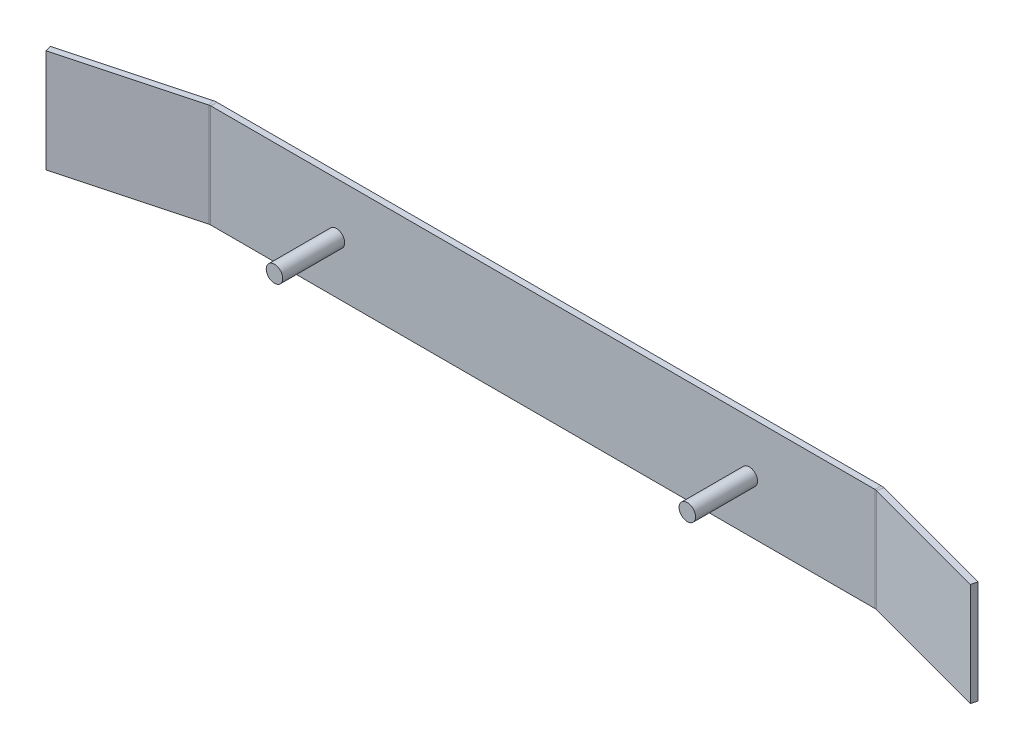
ISO-10303-21;
HEADER;
FILE_DESCRIPTION(('STEP AP214'),'2;1');
FILE_NAME('part.step','',(''),(''),'','','');
FILE_SCHEMA(('AUTOMOTIVE_DESIGN { 1 0 10303 214 1 1 1 1 }'));
ENDSEC;
DATA;
#1=APPLICATION_CONTEXT('core data for automotive mechanical design processes');
#2=APPLICATION_PROTOCOL_DEFINITION('international standard','automotive_design',2000,#1);
#3=PRODUCT_CONTEXT('',#1,'mechanical');
#4=PRODUCT('Part','Part','',(#3));
#5=PRODUCT_RELATED_PRODUCT_CATEGORY('part','',(#4));
#6=PRODUCT_DEFINITION_FORMATION('','',#4);
#7=PRODUCT_DEFINITION_CONTEXT('part definition',#1,'design');
#8=PRODUCT_DEFINITION('design','',#6,#7);
#9=PRODUCT_DEFINITION_SHAPE('','',#8);
#10=(LENGTH_UNIT() NAMED_UNIT(*) SI_UNIT(.MILLI.,.METRE.));
#11=(NAMED_UNIT(*) PLANE_ANGLE_UNIT() SI_UNIT($,.RADIAN.));
#12=(NAMED_UNIT(*) SI_UNIT($,.STERADIAN.) SOLID_ANGLE_UNIT());
#13=UNCERTAINTY_MEASURE_WITH_UNIT(LENGTH_MEASURE(1.E-05),#10,'distance_accuracy_value','');
#14=(GEOMETRIC_REPRESENTATION_CONTEXT(3) GLOBAL_UNCERTAINTY_ASSIGNED_CONTEXT((#13)) GLOBAL_UNIT_ASSIGNED_CONTEXT((#10,
#11,#12)) REPRESENTATION_CONTEXT('',''));
#15=CARTESIAN_POINT('',(0.,0.,0.));
#16=DIRECTION('',(0.,0.,1.));
#17=DIRECTION('',(1.,0.,0.));
#18=AXIS2_PLACEMENT_3D('',#15,#16,#17);
#19=CARTESIAN_POINT('',(-226.5,-25.,-3.));
#20=DIRECTION('',(0.,-1.,0.));
#21=DIRECTION('',(1.,0.,0.));
#22=AXIS2_PLACEMENT_3D('',#19,#20,#21);
#23=PLANE('',#22);
#24=DIRECTION('',(1.,0.,0.));
#25=VECTOR('',#24,1.);
#26=CARTESIAN_POINT('',(-226.5,-25.,-3.));
#27=LINE('',#26,#25);
#28=CARTESIAN_POINT('',(-160.910951377452,-25.,-3.));
#29=VERTEX_POINT('',#28);
#30=CARTESIAN_POINT('',(160.910951377452,-25.,-3.));
#31=VERTEX_POINT('',#30);
#32=EDGE_CURVE('E227',#29,#31,#27,.T.);
#33=ORIENTED_EDGE('',*,*,#32,.T.);
#34=DIRECTION('',(0.,0.,1.));
#35=VECTOR('',#34,1.);
#36=CARTESIAN_POINT('',(160.910951377452,-25.,-3.));
#37=LINE('',#36,#35);
#38=CARTESIAN_POINT('',(160.910951377452,-25.,0.));
#39=VERTEX_POINT('',#38);
#40=EDGE_CURVE('E243',#31,#39,#37,.T.);
#41=ORIENTED_EDGE('',*,*,#40,.T.);
#42=DIRECTION('',(1.,0.,0.));
#43=VECTOR('',#42,1.);
#44=CARTESIAN_POINT('',(-226.5,-25.,0.));
#45=LINE('',#44,#43);
#46=CARTESIAN_POINT('',(-160.910951377452,-25.,0.));
#47=VERTEX_POINT('',#46);
#48=EDGE_CURVE('E249',#47,#39,#45,.T.);
#49=ORIENTED_EDGE('',*,*,#48,.F.);
#50=DIRECTION('',(0.,0.,1.));
#51=VECTOR('',#50,1.);
#52=CARTESIAN_POINT('',(-160.910951377452,-25.,-3.));
#53=LINE('',#52,#51);
#54=EDGE_CURVE('E226',#29,#47,#53,.T.);
#55=ORIENTED_EDGE('',*,*,#54,.F.);
#56=EDGE_LOOP('',(#33,#41,#49,#55));
#57=FACE_BOUND('',#56,.T.);
#58=ADVANCED_FACE('F47',(#57),#23,.T.);
#59=CARTESIAN_POINT('',(-226.5,25.,-3.));
#60=DIRECTION('',(0.,1.,0.));
#61=DIRECTION('',(-1.,0.,0.));
#62=AXIS2_PLACEMENT_3D('',#59,#60,#61);
#63=PLANE('',#62);
#64=DIRECTION('',(-1.,0.,0.));
#65=VECTOR('',#64,1.);
#66=CARTESIAN_POINT('',(-226.5,25.,0.));
#67=LINE('',#66,#65);
#68=CARTESIAN_POINT('',(160.910951377452,25.,0.));
#69=VERTEX_POINT('',#68);
#70=CARTESIAN_POINT('',(-160.910951377452,25.,0.));
#71=VERTEX_POINT('',#70);
#72=EDGE_CURVE('E69',#69,#71,#67,.T.);
#73=ORIENTED_EDGE('',*,*,#72,.F.);
#74=DIRECTION('',(0.,0.,-1.));
#75=VECTOR('',#74,1.);
#76=CARTESIAN_POINT('',(160.910951377452,25.,-3.));
#77=LINE('',#76,#75);
#78=CARTESIAN_POINT('',(160.910951377452,25.,-3.));
#79=VERTEX_POINT('',#78);
#80=EDGE_CURVE('E238',#69,#79,#77,.T.);
#81=ORIENTED_EDGE('',*,*,#80,.T.);
#82=DIRECTION('',(-1.,0.,0.));
#83=VECTOR('',#82,1.);
#84=CARTESIAN_POINT('',(-226.5,25.,-3.));
#85=LINE('',#84,#83);
#86=CARTESIAN_POINT('',(-160.910951377452,25.,-3.));
#87=VERTEX_POINT('',#86);
#88=EDGE_CURVE('E248',#79,#87,#85,.T.);
#89=ORIENTED_EDGE('',*,*,#88,.T.);
#90=DIRECTION('',(0.,0.,-1.));
#91=VECTOR('',#90,1.);
#92=CARTESIAN_POINT('',(-160.910951377452,25.,-3.));
#93=LINE('',#92,#91);
#94=EDGE_CURVE('E232',#71,#87,#93,.T.);
#95=ORIENTED_EDGE('',*,*,#94,.F.);
#96=EDGE_LOOP('',(#73,#81,#89,#95));
#97=FACE_BOUND('',#96,.T.);
#98=ADVANCED_FACE('F272',(#97),#63,.T.);
#99=CARTESIAN_POINT('',(0.,0.,-3.));
#100=DIRECTION('',(0.,0.,-1.));
#101=DIRECTION('',(-1.,0.,0.));
#102=AXIS2_PLACEMENT_3D('',#99,#100,#101);
#103=PLANE('',#102);
#104=ORIENTED_EDGE('',*,*,#88,.F.);
#105=DIRECTION('',(0.,-1.,0.));
#106=VECTOR('',#105,1.);
#107=CARTESIAN_POINT('',(160.910951377452,0.,-3.));
#108=LINE('',#107,#106);
#109=EDGE_CURVE('E235',#79,#31,#108,.T.);
#110=ORIENTED_EDGE('',*,*,#109,.T.);
#111=ORIENTED_EDGE('',*,*,#32,.F.);
#112=DIRECTION('',(0.,-1.,0.));
#113=VECTOR('',#112,1.);
#114=CARTESIAN_POINT('',(-160.910951377452,0.,-3.));
#115=LINE('',#114,#113);
#116=EDGE_CURVE('E223',#87,#29,#115,.T.);
#117=ORIENTED_EDGE('',*,*,#116,.F.);
#118=EDGE_LOOP('',(#104,#110,#111,#117));
#119=FACE_BOUND('',#118,.T.);
#120=ADVANCED_FACE('F262',(#119),#103,.T.);
#121=CARTESIAN_POINT('',(0.,0.,0.));
#122=DIRECTION('',(0.,0.,-1.));
#123=DIRECTION('',(-1.,0.,0.));
#124=AXIS2_PLACEMENT_3D('',#121,#122,#123);
#125=PLANE('',#124);
#126=CARTESIAN_POINT('',(100.,0.,0.));
#127=DIRECTION('',(0.,0.,-1.));
#128=DIRECTION('',(-1.,0.,0.));
#129=AXIS2_PLACEMENT_3D('',#126,#127,#128);
#130=CIRCLE('',#129,4.00000000000001);
#131=CARTESIAN_POINT('',(96.,0.,0.));
#132=VERTEX_POINT('',#131);
#133=EDGE_CURVE('E12',#132,#132,#130,.F.);
#134=ORIENTED_EDGE('',*,*,#133,.F.);
#135=EDGE_LOOP('',(#134));
#136=FACE_BOUND('',#135,.T.);
#137=CARTESIAN_POINT('',(-100.,0.,0.));
#138=DIRECTION('',(0.,0.,-1.));
#139=DIRECTION('',(-1.,0.,0.));
#140=AXIS2_PLACEMENT_3D('',#137,#138,#139);
#141=CIRCLE('',#140,4.00000000000001);
#142=CARTESIAN_POINT('',(-104.,0.,0.));
#143=VERTEX_POINT('',#142);
#144=EDGE_CURVE('E54',#143,#143,#141,.F.);
#145=ORIENTED_EDGE('',*,*,#144,.F.);
#146=EDGE_LOOP('',(#145));
#147=FACE_BOUND('',#146,.T.);
#148=DIRECTION('',(0.,-1.,0.));
#149=VECTOR('',#148,1.);
#150=CARTESIAN_POINT('',(160.910951377452,0.,0.));
#151=LINE('',#150,#149);
#152=EDGE_CURVE('E241',#69,#39,#151,.T.);
#153=ORIENTED_EDGE('',*,*,#152,.F.);
#154=ORIENTED_EDGE('',*,*,#72,.T.);
#155=DIRECTION('',(0.,-1.,0.));
#156=VECTOR('',#155,1.);
#157=CARTESIAN_POINT('',(-160.910951377452,0.,0.));
#158=LINE('',#157,#156);
#159=EDGE_CURVE('E230',#71,#47,#158,.T.);
#160=ORIENTED_EDGE('',*,*,#159,.T.);
#161=ORIENTED_EDGE('',*,*,#48,.T.);
#162=EDGE_LOOP('',(#153,#154,#160,#161));
#163=FACE_BOUND('',#162,.T.);
#164=ADVANCED_FACE('F259',(#136,#147,#163),#125,.F.);
#165=CARTESIAN_POINT('',(-160.910951377452,25.,3.));
#166=DIRECTION('',(0.,1.,0.));
#167=DIRECTION('',(0.,0.,1.));
#168=AXIS2_PLACEMENT_3D('',#165,#166,#167);
#169=PLANE('',#168);
#170=DIRECTION('',(-0.258819045102521,0.,-0.965925826289068));
#171=VECTOR('',#170,1.);
#172=CARTESIAN_POINT('',(-162.463865648067,25.,-2.79555495773442));
#173=LINE('',#172,#171);
#174=CARTESIAN_POINT('',(-161.68740851276,25.,0.102222521132796));
#175=VERTEX_POINT('',#174);
#176=CARTESIAN_POINT('',(-162.463865648067,25.,-2.79555495773441));
#177=VERTEX_POINT('',#176);
#178=EDGE_CURVE('E188',#175,#177,#173,.T.);
#179=ORIENTED_EDGE('',*,*,#178,.F.);
#180=CARTESIAN_POINT('',(-160.910951377452,25.,3.));
#181=DIRECTION('',(0.,1.,0.));
#182=DIRECTION('',(0.,0.,1.));
#183=AXIS2_PLACEMENT_3D('',#180,#181,#182);
#184=CIRCLE('',#183,3.);
#185=EDGE_CURVE('E185',#175,#71,#184,.F.);
#186=ORIENTED_EDGE('',*,*,#185,.T.);
#187=ORIENTED_EDGE('',*,*,#94,.T.);
#188=CARTESIAN_POINT('',(-160.910951377452,25.,3.));
#189=DIRECTION('',(0.,-1.,0.));
#190=DIRECTION('',(0.,0.,1.));
#191=AXIS2_PLACEMENT_3D('',#188,#189,#190);
#192=CIRCLE('',#191,6.);
#193=EDGE_CURVE('E212',#177,#87,#192,.T.);
#194=ORIENTED_EDGE('',*,*,#193,.F.);
#195=EDGE_LOOP('',(#179,#186,#187,#194));
#196=FACE_BOUND('',#195,.T.);
#197=ADVANCED_FACE('F261',(#196),#169,.T.);
#198=CARTESIAN_POINT('',(-160.910951377452,-25.,3.));
#199=DIRECTION('',(0.,-1.,0.));
#200=DIRECTION('',(0.,0.,-1.));
#201=AXIS2_PLACEMENT_3D('',#198,#199,#200);
#202=PLANE('',#201);
#203=CARTESIAN_POINT('',(-160.910951377452,-25.,3.));
#204=DIRECTION('',(0.,1.,0.));
#205=DIRECTION('',(0.,0.,1.));
#206=AXIS2_PLACEMENT_3D('',#203,#204,#205);
#207=CIRCLE('',#206,3.);
#208=CARTESIAN_POINT('',(-161.687408512759,-25.,0.102222521132789));
#209=VERTEX_POINT('',#208);
#210=EDGE_CURVE('E216',#47,#209,#207,.T.);
#211=ORIENTED_EDGE('',*,*,#210,.T.);
#212=DIRECTION('',(0.258819045102521,0.,0.965925826289068));
#213=VECTOR('',#212,1.);
#214=CARTESIAN_POINT('',(-162.463865648067,-25.,-2.79555495773442));
#215=LINE('',#214,#213);
#216=CARTESIAN_POINT('',(-162.463865648067,-25.,-2.79555495773442));
#217=VERTEX_POINT('',#216);
#218=EDGE_CURVE('E197',#217,#209,#215,.T.);
#219=ORIENTED_EDGE('',*,*,#218,.F.);
#220=CARTESIAN_POINT('',(-160.910951377452,-25.,3.));
#221=DIRECTION('',(0.,1.,0.));
#222=DIRECTION('',(0.,0.,-1.));
#223=AXIS2_PLACEMENT_3D('',#220,#221,#222);
#224=CIRCLE('',#223,6.);
#225=EDGE_CURVE('E215',#29,#217,#224,.T.);
#226=ORIENTED_EDGE('',*,*,#225,.F.);
#227=ORIENTED_EDGE('',*,*,#54,.T.);
#228=EDGE_LOOP('',(#211,#219,#226,#227));
#229=FACE_BOUND('',#228,.T.);
#230=ADVANCED_FACE('F297',(#229),#202,.T.);
#231=CARTESIAN_POINT('',(-160.910951377452,-50.1037714460589,3.));
#232=DIRECTION('',(0.,1.,0.));
#233=DIRECTION('',(0.,0.,1.));
#234=AXIS2_PLACEMENT_3D('',#231,#232,#233);
#235=CYLINDRICAL_SURFACE('',#234,6.);
#236=ORIENTED_EDGE('',*,*,#116,.T.);
#237=ORIENTED_EDGE('',*,*,#225,.T.);
#238=DIRECTION('',(0.,-1.,0.));
#239=VECTOR('',#238,1.);
#240=CARTESIAN_POINT('',(-162.463865648067,0.,-2.79555495773442));
#241=LINE('',#240,#239);
#242=EDGE_CURVE('E203',#177,#217,#241,.T.);
#243=ORIENTED_EDGE('',*,*,#242,.F.);
#244=ORIENTED_EDGE('',*,*,#193,.T.);
#245=EDGE_LOOP('',(#236,#237,#243,#244));
#246=FACE_BOUND('',#245,.T.);
#247=ADVANCED_FACE('F293',(#246),#235,.T.);
#248=CARTESIAN_POINT('',(-160.910951377452,-50.1037714460589,3.));
#249=DIRECTION('',(0.,1.,0.));
#250=DIRECTION('',(0.,0.,1.));
#251=AXIS2_PLACEMENT_3D('',#248,#249,#250);
#252=CYLINDRICAL_SURFACE('',#251,3.);
#253=ORIENTED_EDGE('',*,*,#159,.F.);
#254=ORIENTED_EDGE('',*,*,#185,.F.);
#255=DIRECTION('',(0.,-1.,0.));
#256=VECTOR('',#255,1.);
#257=CARTESIAN_POINT('',(-161.687408512759,0.,0.102222521132789));
#258=LINE('',#257,#256);
#259=EDGE_CURVE('E178',#175,#209,#258,.T.);
#260=ORIENTED_EDGE('',*,*,#259,.T.);
#261=ORIENTED_EDGE('',*,*,#210,.F.);
#262=EDGE_LOOP('',(#253,#254,#260,#261));
#263=FACE_BOUND('',#262,.T.);
#264=ADVANCED_FACE('F280',(#263),#252,.F.);
#265=CARTESIAN_POINT('',(-224.680067079397,-25.,13.8752259719226));
#266=DIRECTION('',(-0.965925826289068,0.,0.258819045102521));
#267=DIRECTION('',(0.258819045102521,0.,0.965925826289068));
#268=AXIS2_PLACEMENT_3D('',#265,#266,#267);
#269=PLANE('',#268);
#270=DIRECTION('',(0.,-1.,0.));
#271=VECTOR('',#270,1.);
#272=CARTESIAN_POINT('',(-223.90360994409,-25.,16.7730034507898));
#273=LINE('',#272,#271);
#274=CARTESIAN_POINT('',(-223.90360994409,25.,16.7730034507898));
#275=VERTEX_POINT('',#274);
#276=CARTESIAN_POINT('',(-223.90360994409,-25.,16.7730034507898));
#277=VERTEX_POINT('',#276);
#278=EDGE_CURVE('E192',#275,#277,#273,.T.);
#279=ORIENTED_EDGE('',*,*,#278,.F.);
#280=DIRECTION('',(0.258819045102521,0.,0.965925826289068));
#281=VECTOR('',#280,1.);
#282=CARTESIAN_POINT('',(-224.680067079397,25.,13.8752259719226));
#283=LINE('',#282,#281);
#284=CARTESIAN_POINT('',(-224.680067079397,25.,13.8752259719226));
#285=VERTEX_POINT('',#284);
#286=EDGE_CURVE('E182',#285,#275,#283,.T.);
#287=ORIENTED_EDGE('',*,*,#286,.F.);
#288=DIRECTION('',(0.,-1.,0.));
#289=VECTOR('',#288,1.);
#290=CARTESIAN_POINT('',(-224.680067079397,-25.,13.8752259719226));
#291=LINE('',#290,#289);
#292=CARTESIAN_POINT('',(-224.680067079397,-25.,13.8752259719226));
#293=VERTEX_POINT('',#292);
#294=EDGE_CURVE('E207',#285,#293,#291,.T.);
#295=ORIENTED_EDGE('',*,*,#294,.T.);
#296=DIRECTION('',(0.258819045102521,0.,0.965925826289068));
#297=VECTOR('',#296,1.);
#298=CARTESIAN_POINT('',(-224.680067079397,-25.,13.8752259719226));
#299=LINE('',#298,#297);
#300=EDGE_CURVE('E205',#293,#277,#299,.T.);
#301=ORIENTED_EDGE('',*,*,#300,.T.);
#302=EDGE_LOOP('',(#279,#287,#295,#301));
#303=FACE_BOUND('',#302,.T.);
#304=ADVANCED_FACE('F306',(#303),#269,.T.);
#305=CARTESIAN_POINT('',(-5.89786742492336,0.,-44.7472877437985));
#306=DIRECTION('',(-0.258819045102521,0.,-0.965925826289068));
#307=DIRECTION('',(-0.965925826289068,0.,0.258819045102521));
#308=AXIS2_PLACEMENT_3D('',#305,#306,#307);
#309=PLANE('',#308);
#310=DIRECTION('',(-0.965925826289068,0.,0.258819045102521));
#311=VECTOR('',#310,1.);
#312=CARTESIAN_POINT('',(-224.680067079397,25.,13.8752259719226));
#313=LINE('',#312,#311);
#314=EDGE_CURVE('E186',#177,#285,#313,.T.);
#315=ORIENTED_EDGE('',*,*,#314,.F.);
#316=ORIENTED_EDGE('',*,*,#242,.T.);
#317=DIRECTION('',(0.965925826289068,0.,-0.258819045102521));
#318=VECTOR('',#317,1.);
#319=CARTESIAN_POINT('',(-224.680067079397,-25.,13.8752259719226));
#320=LINE('',#319,#318);
#321=EDGE_CURVE('E200',#293,#217,#320,.T.);
#322=ORIENTED_EDGE('',*,*,#321,.F.);
#323=ORIENTED_EDGE('',*,*,#294,.F.);
#324=EDGE_LOOP('',(#315,#316,#322,#323));
#325=FACE_BOUND('',#324,.T.);
#326=ADVANCED_FACE('F290',(#325),#309,.T.);
#327=CARTESIAN_POINT('',(-224.680067079397,-25.,13.8752259719226));
#328=DIRECTION('',(0.,-1.,0.));
#329=DIRECTION('',(0.965925826289068,0.,-0.258819045102521));
#330=AXIS2_PLACEMENT_3D('',#327,#328,#329);
#331=PLANE('',#330);
#332=ORIENTED_EDGE('',*,*,#321,.T.);
#333=ORIENTED_EDGE('',*,*,#218,.T.);
#334=DIRECTION('',(0.965925826289068,0.,-0.258819045102521));
#335=VECTOR('',#334,1.);
#336=CARTESIAN_POINT('',(-223.90360994409,-25.,16.7730034507898));
#337=LINE('',#336,#335);
#338=EDGE_CURVE('E190',#277,#209,#337,.T.);
#339=ORIENTED_EDGE('',*,*,#338,.F.);
#340=ORIENTED_EDGE('',*,*,#300,.F.);
#341=EDGE_LOOP('',(#332,#333,#339,#340));
#342=FACE_BOUND('',#341,.T.);
#343=ADVANCED_FACE('F301',(#342),#331,.T.);
#344=CARTESIAN_POINT('',(-5.1214102896158,0.,-41.8495102649313));
#345=DIRECTION('',(-0.258819045102521,0.,-0.965925826289068));
#346=DIRECTION('',(-0.965925826289068,0.,0.258819045102521));
#347=AXIS2_PLACEMENT_3D('',#344,#345,#346);
#348=PLANE('',#347);
#349=ORIENTED_EDGE('',*,*,#259,.F.);
#350=DIRECTION('',(-0.965925826289068,0.,0.258819045102521));
#351=VECTOR('',#350,1.);
#352=CARTESIAN_POINT('',(-223.90360994409,25.,16.7730034507898));
#353=LINE('',#352,#351);
#354=EDGE_CURVE('E195',#175,#275,#353,.T.);
#355=ORIENTED_EDGE('',*,*,#354,.T.);
#356=ORIENTED_EDGE('',*,*,#278,.T.);
#357=ORIENTED_EDGE('',*,*,#338,.T.);
#358=EDGE_LOOP('',(#349,#355,#356,#357));
#359=FACE_BOUND('',#358,.T.);
#360=ADVANCED_FACE('F303',(#359),#348,.F.);
#361=CARTESIAN_POINT('',(-224.680067079397,25.,13.8752259719226));
#362=DIRECTION('',(0.,1.,0.));
#363=DIRECTION('',(-0.965925826289068,0.,0.258819045102521));
#364=AXIS2_PLACEMENT_3D('',#361,#362,#363);
#365=PLANE('',#364);
#366=ORIENTED_EDGE('',*,*,#354,.F.);
#367=ORIENTED_EDGE('',*,*,#178,.T.);
#368=ORIENTED_EDGE('',*,*,#314,.T.);
#369=ORIENTED_EDGE('',*,*,#286,.T.);
#370=EDGE_LOOP('',(#366,#367,#368,#369));
#371=FACE_BOUND('',#370,.T.);
#372=ADVANCED_FACE('F284',(#371),#365,.T.);
#373=CARTESIAN_POINT('',(160.910951377452,25.,3.));
#374=DIRECTION('',(0.,1.,0.));
#375=DIRECTION('',(0.,0.,1.));
#376=AXIS2_PLACEMENT_3D('',#373,#374,#375);
#377=PLANE('',#376);
#378=ORIENTED_EDGE('',*,*,#80,.F.);
#379=CARTESIAN_POINT('',(160.910951377452,25.,3.));
#380=DIRECTION('',(0.,-1.,0.));
#381=DIRECTION('',(1.,0.,0.));
#382=AXIS2_PLACEMENT_3D('',#379,#380,#381);
#383=CIRCLE('',#382,3.);
#384=CARTESIAN_POINT('',(161.687408512759,25.,0.10222252113274));
#385=VERTEX_POINT('',#384);
#386=EDGE_CURVE('E154',#69,#385,#383,.T.);
#387=ORIENTED_EDGE('',*,*,#386,.T.);
#388=DIRECTION('',(0.258819045102521,0.,-0.965925826289068));
#389=VECTOR('',#388,1.);
#390=CARTESIAN_POINT('',(162.463865648067,25.,-2.79555495773444));
#391=LINE('',#390,#389);
#392=CARTESIAN_POINT('',(162.463865648067,25.,-2.79555495773445));
#393=VERTEX_POINT('',#392);
#394=EDGE_CURVE('E161',#385,#393,#391,.T.);
#395=ORIENTED_EDGE('',*,*,#394,.T.);
#396=CARTESIAN_POINT('',(160.910951377452,25.,3.));
#397=DIRECTION('',(0.,-1.,0.));
#398=DIRECTION('',(0.,0.,1.));
#399=AXIS2_PLACEMENT_3D('',#396,#397,#398);
#400=CIRCLE('',#399,6.);
#401=EDGE_CURVE('E172',#79,#393,#400,.T.);
#402=ORIENTED_EDGE('',*,*,#401,.F.);
#403=EDGE_LOOP('',(#378,#387,#395,#402));
#404=FACE_BOUND('',#403,.T.);
#405=ADVANCED_FACE('F327',(#404),#377,.T.);
#406=CARTESIAN_POINT('',(160.910951377452,-25.,3.));
#407=DIRECTION('',(0.,-1.,0.));
#408=DIRECTION('',(0.,0.,-1.));
#409=AXIS2_PLACEMENT_3D('',#406,#407,#408);
#410=PLANE('',#409);
#411=CARTESIAN_POINT('',(160.910951377452,-25.,3.));
#412=DIRECTION('',(0.,-1.,0.));
#413=DIRECTION('',(1.,0.,0.));
#414=AXIS2_PLACEMENT_3D('',#411,#412,#413);
#415=CIRCLE('',#414,3.);
#416=CARTESIAN_POINT('',(161.68740851276,-25.,0.102222521132782));
#417=VERTEX_POINT('',#416);
#418=EDGE_CURVE('E61',#417,#39,#415,.F.);
#419=ORIENTED_EDGE('',*,*,#418,.T.);
#420=ORIENTED_EDGE('',*,*,#40,.F.);
#421=CARTESIAN_POINT('',(160.910951377452,-25.,3.));
#422=DIRECTION('',(0.,1.,0.));
#423=DIRECTION('',(0.,0.,-1.));
#424=AXIS2_PLACEMENT_3D('',#421,#422,#423);
#425=CIRCLE('',#424,6.);
#426=CARTESIAN_POINT('',(162.463865648067,-25.,-2.79555495773439));
#427=VERTEX_POINT('',#426);
#428=EDGE_CURVE('E175',#427,#31,#425,.T.);
#429=ORIENTED_EDGE('',*,*,#428,.F.);
#430=DIRECTION('',(-0.258819045102521,0.,0.965925826289068));
#431=VECTOR('',#430,1.);
#432=CARTESIAN_POINT('',(162.463865648067,-25.,-2.79555495773443));
#433=LINE('',#432,#431);
#434=EDGE_CURVE('E143',#427,#417,#433,.T.);
#435=ORIENTED_EDGE('',*,*,#434,.T.);
#436=EDGE_LOOP('',(#419,#420,#429,#435));
#437=FACE_BOUND('',#436,.T.);
#438=ADVANCED_FACE('F378',(#437),#410,.T.);
#439=CARTESIAN_POINT('',(160.910951377452,50.1037714460589,3.));
#440=DIRECTION('',(0.,-1.,0.));
#441=DIRECTION('',(1.,0.,0.));
#442=AXIS2_PLACEMENT_3D('',#439,#440,#441);
#443=CYLINDRICAL_SURFACE('',#442,6.);
#444=DIRECTION('',(0.,-1.,0.));
#445=VECTOR('',#444,1.);
#446=CARTESIAN_POINT('',(162.463865648067,0.,-2.79555495773443));
#447=LINE('',#446,#445);
#448=EDGE_CURVE('E169',#393,#427,#447,.T.);
#449=ORIENTED_EDGE('',*,*,#448,.T.);
#450=ORIENTED_EDGE('',*,*,#428,.T.);
#451=ORIENTED_EDGE('',*,*,#109,.F.);
#452=ORIENTED_EDGE('',*,*,#401,.T.);
#453=EDGE_LOOP('',(#449,#450,#451,#452));
#454=FACE_BOUND('',#453,.T.);
#455=ADVANCED_FACE('F325',(#454),#443,.T.);
#456=CARTESIAN_POINT('',(160.910951377452,50.1037714460589,3.));
#457=DIRECTION('',(0.,-1.,0.));
#458=DIRECTION('',(1.,0.,0.));
#459=AXIS2_PLACEMENT_3D('',#456,#457,#458);
#460=CYLINDRICAL_SURFACE('',#459,3.);
#461=DIRECTION('',(0.,-1.,0.));
#462=VECTOR('',#461,1.);
#463=CARTESIAN_POINT('',(161.68740851276,0.,0.102222521132775));
#464=LINE('',#463,#462);
#465=EDGE_CURVE('E269',#385,#417,#464,.T.);
#466=ORIENTED_EDGE('',*,*,#465,.F.);
#467=ORIENTED_EDGE('',*,*,#386,.F.);
#468=ORIENTED_EDGE('',*,*,#152,.T.);
#469=ORIENTED_EDGE('',*,*,#418,.F.);
#470=EDGE_LOOP('',(#466,#467,#468,#469));
#471=FACE_BOUND('',#470,.T.);
#472=ADVANCED_FACE('F267',(#471),#460,.F.);
#473=CARTESIAN_POINT('',(224.680067079397,-25.,13.8752259719226));
#474=DIRECTION('',(0.965925826289068,0.,0.258819045102521));
#475=DIRECTION('',(0.,1.,0.));
#476=AXIS2_PLACEMENT_3D('',#473,#474,#475);
#477=PLANE('',#476);
#478=DIRECTION('',(0.,1.,0.));
#479=VECTOR('',#478,1.);
#480=CARTESIAN_POINT('',(223.90360994409,-25.,16.7730034507898));
#481=LINE('',#480,#479);
#482=CARTESIAN_POINT('',(223.90360994409,-25.,16.7730034507898));
#483=VERTEX_POINT('',#482);
#484=CARTESIAN_POINT('',(223.90360994409,25.,16.7730034507898));
#485=VERTEX_POINT('',#484);
#486=EDGE_CURVE('E147',#483,#485,#481,.T.);
#487=ORIENTED_EDGE('',*,*,#486,.F.);
#488=DIRECTION('',(-0.258819045102521,0.,0.965925826289068));
#489=VECTOR('',#488,1.);
#490=CARTESIAN_POINT('',(224.680067079397,-25.,13.8752259719226));
#491=LINE('',#490,#489);
#492=CARTESIAN_POINT('',(224.680067079397,-25.,13.8752259719226));
#493=VERTEX_POINT('',#492);
#494=EDGE_CURVE('E141',#493,#483,#491,.T.);
#495=ORIENTED_EDGE('',*,*,#494,.F.);
#496=DIRECTION('',(0.,1.,0.));
#497=VECTOR('',#496,1.);
#498=CARTESIAN_POINT('',(224.680067079397,-25.,13.8752259719226));
#499=LINE('',#498,#497);
#500=CARTESIAN_POINT('',(224.680067079397,25.,13.8752259719226));
#501=VERTEX_POINT('',#500);
#502=EDGE_CURVE('E152',#493,#501,#499,.T.);
#503=ORIENTED_EDGE('',*,*,#502,.T.);
#504=DIRECTION('',(-0.258819045102521,0.,0.965925826289068));
#505=VECTOR('',#504,1.);
#506=CARTESIAN_POINT('',(224.680067079397,25.,13.8752259719226));
#507=LINE('',#506,#505);
#508=EDGE_CURVE('E160',#501,#485,#507,.T.);
#509=ORIENTED_EDGE('',*,*,#508,.T.);
#510=EDGE_LOOP('',(#487,#495,#503,#509));
#511=FACE_BOUND('',#510,.T.);
#512=ADVANCED_FACE('F151',(#511),#477,.T.);
#513=CARTESIAN_POINT('',(5.89786742492336,0.,-44.7472877437985));
#514=DIRECTION('',(0.258819045102521,0.,-0.965925826289068));
#515=DIRECTION('',(-0.965925826289068,0.,-0.258819045102521));
#516=AXIS2_PLACEMENT_3D('',#513,#514,#515);
#517=PLANE('',#516);
#518=ORIENTED_EDGE('',*,*,#448,.F.);
#519=DIRECTION('',(-0.965925826289068,0.,-0.258819045102521));
#520=VECTOR('',#519,1.);
#521=CARTESIAN_POINT('',(-212.884332229551,25.,-103.36980145952));
#522=LINE('',#521,#520);
#523=EDGE_CURVE('E159',#501,#393,#522,.T.);
#524=ORIENTED_EDGE('',*,*,#523,.F.);
#525=ORIENTED_EDGE('',*,*,#502,.F.);
#526=DIRECTION('',(0.965925826289068,0.,0.258819045102521));
#527=VECTOR('',#526,1.);
#528=CARTESIAN_POINT('',(-212.884332229551,-25.,-103.36980145952));
#529=LINE('',#528,#527);
#530=EDGE_CURVE('E138',#427,#493,#529,.T.);
#531=ORIENTED_EDGE('',*,*,#530,.F.);
#532=EDGE_LOOP('',(#518,#524,#525,#531));
#533=FACE_BOUND('',#532,.T.);
#534=ADVANCED_FACE('F157',(#533),#517,.T.);
#535=CARTESIAN_POINT('',(-212.884332229551,25.,-103.36980145952));
#536=DIRECTION('',(0.,1.,0.));
#537=DIRECTION('',(-0.965925826289068,0.,-0.258819045102521));
#538=AXIS2_PLACEMENT_3D('',#535,#536,#537);
#539=PLANE('',#538);
#540=ORIENTED_EDGE('',*,*,#394,.F.);
#541=DIRECTION('',(-0.965925826289068,0.,-0.258819045102521));
#542=VECTOR('',#541,1.);
#543=CARTESIAN_POINT('',(-213.660789364858,25.,-100.472023980652));
#544=LINE('',#543,#542);
#545=EDGE_CURVE('E332',#485,#385,#544,.T.);
#546=ORIENTED_EDGE('',*,*,#545,.F.);
#547=ORIENTED_EDGE('',*,*,#508,.F.);
#548=ORIENTED_EDGE('',*,*,#523,.T.);
#549=EDGE_LOOP('',(#540,#546,#547,#548));
#550=FACE_BOUND('',#549,.T.);
#551=ADVANCED_FACE('F331',(#550),#539,.T.);
#552=CARTESIAN_POINT('',(5.1214102896158,0.,-41.8495102649313));
#553=DIRECTION('',(0.258819045102521,0.,-0.965925826289068));
#554=DIRECTION('',(-0.965925826289068,0.,-0.258819045102521));
#555=AXIS2_PLACEMENT_3D('',#552,#553,#554);
#556=PLANE('',#555);
#557=ORIENTED_EDGE('',*,*,#545,.T.);
#558=ORIENTED_EDGE('',*,*,#465,.T.);
#559=DIRECTION('',(0.965925826289068,0.,0.258819045102521));
#560=VECTOR('',#559,1.);
#561=CARTESIAN_POINT('',(-213.660789364858,-25.,-100.472023980652));
#562=LINE('',#561,#560);
#563=EDGE_CURVE('E336',#417,#483,#562,.T.);
#564=ORIENTED_EDGE('',*,*,#563,.T.);
#565=ORIENTED_EDGE('',*,*,#486,.T.);
#566=EDGE_LOOP('',(#557,#558,#564,#565));
#567=FACE_BOUND('',#566,.T.);
#568=ADVANCED_FACE('F370',(#567),#556,.F.);
#569=CARTESIAN_POINT('',(-212.884332229551,-25.,-103.36980145952));
#570=DIRECTION('',(0.,-1.,0.));
#571=DIRECTION('',(0.965925826289068,0.,0.258819045102521));
#572=AXIS2_PLACEMENT_3D('',#569,#570,#571);
#573=PLANE('',#572);
#574=ORIENTED_EDGE('',*,*,#434,.F.);
#575=ORIENTED_EDGE('',*,*,#530,.T.);
#576=ORIENTED_EDGE('',*,*,#494,.T.);
#577=ORIENTED_EDGE('',*,*,#563,.F.);
#578=EDGE_LOOP('',(#574,#575,#576,#577));
#579=FACE_BOUND('',#578,.T.);
#580=ADVANCED_FACE('F140',(#579),#573,.T.);
#581=CARTESIAN_POINT('',(-100.,0.,30.));
#582=DIRECTION('',(0.,0.,-1.));
#583=DIRECTION('',(-1.,0.,0.));
#584=AXIS2_PLACEMENT_3D('',#581,#582,#583);
#585=CYLINDRICAL_SURFACE('',#584,4.00000000000001);
#586=CARTESIAN_POINT('',(-100.,0.,30.));
#587=DIRECTION('',(0.,0.,1.));
#588=DIRECTION('',(1.,0.,0.));
#589=AXIS2_PLACEMENT_3D('',#586,#587,#588);
#590=CIRCLE('',#589,4.00000000000001);
#591=CARTESIAN_POINT('',(-96.,0.,30.));
#592=VERTEX_POINT('',#591);
#593=EDGE_CURVE('E171',#592,#592,#590,.T.);
#594=ORIENTED_EDGE('',*,*,#593,.F.);
#595=EDGE_LOOP('',(#594));
#596=FACE_BOUND('',#595,.T.);
#597=ORIENTED_EDGE('',*,*,#144,.T.);
#598=EDGE_LOOP('',(#597));
#599=FACE_BOUND('',#598,.T.);
#600=ADVANCED_FACE('F257',(#596,#599),#585,.T.);
#601=CARTESIAN_POINT('',(-100.,0.,30.));
#602=DIRECTION('',(0.,0.,1.));
#603=DIRECTION('',(1.,0.,0.));
#604=AXIS2_PLACEMENT_3D('',#601,#602,#603);
#605=PLANE('',#604);
#606=ORIENTED_EDGE('',*,*,#593,.T.);
#607=EDGE_LOOP('',(#606));
#608=FACE_BOUND('',#607,.T.);
#609=ADVANCED_FACE('F350',(#608),#605,.T.);
#610=CARTESIAN_POINT('',(100.,0.,30.));
#611=DIRECTION('',(0.,0.,-1.));
#612=DIRECTION('',(-1.,0.,0.));
#613=AXIS2_PLACEMENT_3D('',#610,#611,#612);
#614=CYLINDRICAL_SURFACE('',#613,4.00000000000001);
#615=CARTESIAN_POINT('',(100.,0.,30.));
#616=DIRECTION('',(0.,0.,1.));
#617=DIRECTION('',(1.,0.,0.));
#618=AXIS2_PLACEMENT_3D('',#615,#616,#617);
#619=CIRCLE('',#618,4.00000000000001);
#620=CARTESIAN_POINT('',(104.,0.,30.));
#621=VERTEX_POINT('',#620);
#622=EDGE_CURVE('E341',#621,#621,#619,.T.);
#623=ORIENTED_EDGE('',*,*,#622,.F.);
#624=EDGE_LOOP('',(#623));
#625=FACE_BOUND('',#624,.T.);
#626=ORIENTED_EDGE('',*,*,#133,.T.);
#627=EDGE_LOOP('',(#626));
#628=FACE_BOUND('',#627,.T.);
#629=ADVANCED_FACE('F347',(#625,#628),#614,.T.);
#630=CARTESIAN_POINT('',(100.,0.,30.));
#631=DIRECTION('',(0.,0.,1.));
#632=DIRECTION('',(1.,0.,0.));
#633=AXIS2_PLACEMENT_3D('',#630,#631,#632);
#634=PLANE('',#633);
#635=ORIENTED_EDGE('',*,*,#622,.T.);
#636=EDGE_LOOP('',(#635));
#637=FACE_BOUND('',#636,.T.);
#638=ADVANCED_FACE('F345',(#637),#634,.T.);
#639=CLOSED_SHELL('',(#58,#98,#120,#164,#197,#230,#247,#264,#304,#326,#343,#360,#372,#405,#438,
#455,#472,#512,#534,#551,#568,#580,#600,#609,#629,#638));
#640=MANIFOLD_SOLID_BREP('B2',#639);
#641=ADVANCED_BREP_SHAPE_REPRESENTATION('',(#18,#640),#14);
#642=SHAPE_DEFINITION_REPRESENTATION(#9,#641);
ENDSEC;
END-ISO-10303-21;
